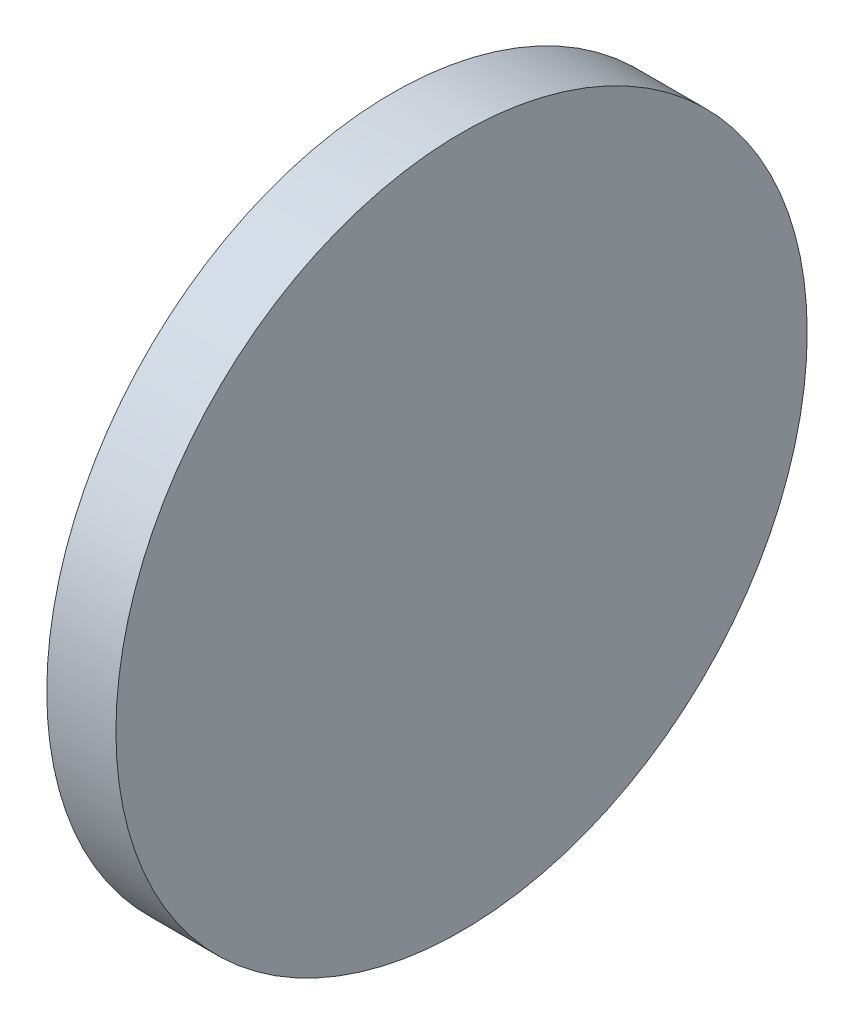
ISO-10303-21;
HEADER;
FILE_DESCRIPTION(('STEP AP214'),'2;1');
FILE_NAME('part.step','',(''),(''),'','','');
FILE_SCHEMA(('AUTOMOTIVE_DESIGN { 1 0 10303 214 1 1 1 1 }'));
ENDSEC;
DATA;
#1=APPLICATION_CONTEXT('core data for automotive mechanical design processes');
#2=APPLICATION_PROTOCOL_DEFINITION('international standard','automotive_design',2000,#1);
#3=PRODUCT_CONTEXT('',#1,'mechanical');
#4=PRODUCT('Part','Part','',(#3));
#5=PRODUCT_RELATED_PRODUCT_CATEGORY('part','',(#4));
#6=PRODUCT_DEFINITION_FORMATION('','',#4);
#7=PRODUCT_DEFINITION_CONTEXT('part definition',#1,'design');
#8=PRODUCT_DEFINITION('design','',#6,#7);
#9=PRODUCT_DEFINITION_SHAPE('','',#8);
#10=(LENGTH_UNIT() NAMED_UNIT(*) SI_UNIT(.MILLI.,.METRE.));
#11=(NAMED_UNIT(*) PLANE_ANGLE_UNIT() SI_UNIT($,.RADIAN.));
#12=(NAMED_UNIT(*) SI_UNIT($,.STERADIAN.) SOLID_ANGLE_UNIT());
#13=UNCERTAINTY_MEASURE_WITH_UNIT(LENGTH_MEASURE(1.E-05),#10,'distance_accuracy_value','');
#14=(GEOMETRIC_REPRESENTATION_CONTEXT(3) GLOBAL_UNCERTAINTY_ASSIGNED_CONTEXT((#13)) GLOBAL_UNIT_ASSIGNED_CONTEXT((#10,
#11,#12)) REPRESENTATION_CONTEXT('',''));
#15=CARTESIAN_POINT('',(0.,0.,0.));
#16=DIRECTION('',(0.,0.,1.));
#17=DIRECTION('',(1.,0.,0.));
#18=AXIS2_PLACEMENT_3D('',#15,#16,#17);
#19=CARTESIAN_POINT('',(2.61861252083204E-13,0.,0.));
#20=DIRECTION('',(1.,0.,0.));
#21=DIRECTION('',(0.,0.,-1.));
#22=AXIS2_PLACEMENT_3D('',#19,#20,#21);
#23=PLANE('',#22);
#24=CARTESIAN_POINT('',(5.55111512312578E-13,0.,0.));
#25=DIRECTION('',(1.,0.,0.));
#26=DIRECTION('',(0.,0.,-1.));
#27=AXIS2_PLACEMENT_3D('',#24,#25,#26);
#28=CIRCLE('',#27,150.);
#29=CARTESIAN_POINT('',(0.,0.,-150.));
#30=VERTEX_POINT('',#29);
#31=EDGE_CURVE('E10',#30,#30,#28,.T.);
#32=ORIENTED_EDGE('',*,*,#31,.T.);
#33=EDGE_LOOP('',(#32));
#34=FACE_BOUND('',#33,.T.);
#35=ADVANCED_FACE('F30',(#34),#23,.T.);
#36=CARTESIAN_POINT('',(1000.,0.,-3.49148336110938E-12));
#37=DIRECTION('',(1.,0.,0.));
#38=DIRECTION('',(0.,0.,-1.));
#39=AXIS2_PLACEMENT_3D('',#36,#37,#38);
#40=CYLINDRICAL_SURFACE('',#39,150.);
#41=CARTESIAN_POINT('',(-29.9999999999996,0.,1.0474450083328E-13));
#42=DIRECTION('',(1.,0.,0.));
#43=DIRECTION('',(0.,0.,-1.));
#44=AXIS2_PLACEMENT_3D('',#41,#42,#43);
#45=CIRCLE('',#44,150.);
#46=CARTESIAN_POINT('',(-30.0000000000001,0.,-150.));
#47=VERTEX_POINT('',#46);
#48=EDGE_CURVE('E36',#47,#47,#45,.T.);
#49=ORIENTED_EDGE('',*,*,#48,.T.);
#50=EDGE_LOOP('',(#49));
#51=FACE_BOUND('',#50,.T.);
#52=ORIENTED_EDGE('',*,*,#31,.F.);
#53=EDGE_LOOP('',(#52));
#54=FACE_BOUND('',#53,.T.);
#55=ADVANCED_FACE('F56',(#51,#54),#40,.T.);
#56=CARTESIAN_POINT('',(-30.,0.,-150.));
#57=DIRECTION('',(-1.,0.,0.));
#58=DIRECTION('',(0.,0.,1.));
#59=AXIS2_PLACEMENT_3D('',#56,#57,#58);
#60=PLANE('',#59);
#61=CARTESIAN_POINT('',(-29.9999999999996,0.,1.0474450083328E-13));
#62=DIRECTION('',(1.,0.,0.));
#63=DIRECTION('',(0.,0.,-1.));
#64=AXIS2_PLACEMENT_3D('',#61,#62,#63);
#65=CIRCLE('',#64,128.5);
#66=CARTESIAN_POINT('',(-30.,0.,-128.5));
#67=VERTEX_POINT('',#66);
#68=EDGE_CURVE('E40',#67,#67,#65,.T.);
#69=ORIENTED_EDGE('',*,*,#68,.T.);
#70=EDGE_LOOP('',(#69));
#71=FACE_BOUND('',#70,.T.);
#72=ORIENTED_EDGE('',*,*,#48,.F.);
#73=EDGE_LOOP('',(#72));
#74=FACE_BOUND('',#73,.T.);
#75=ADVANCED_FACE('F47',(#71,#74),#60,.T.);
#76=CARTESIAN_POINT('',(-479.67361111111,0.,0.));
#77=DIRECTION('',(1.,0.,0.));
#78=DIRECTION('',(0.,0.,-1.));
#79=AXIS2_PLACEMENT_3D('',#76,#77,#78);
#80=SPHERICAL_SURFACE('',#79,467.67361111111);
#81=ORIENTED_EDGE('',*,*,#68,.F.);
#82=EDGE_LOOP('',(#81));
#83=FACE_BOUND('',#82,.T.);
#84=ADVANCED_FACE('F50',(#83),#80,.F.);
#85=CLOSED_SHELL('',(#35,#55,#75,#84));
#86=MANIFOLD_SOLID_BREP('B2',#85);
#87=ADVANCED_BREP_SHAPE_REPRESENTATION('',(#18,#86),#14);
#88=SHAPE_DEFINITION_REPRESENTATION(#9,#87);
ENDSEC;
END-ISO-10303-21;
